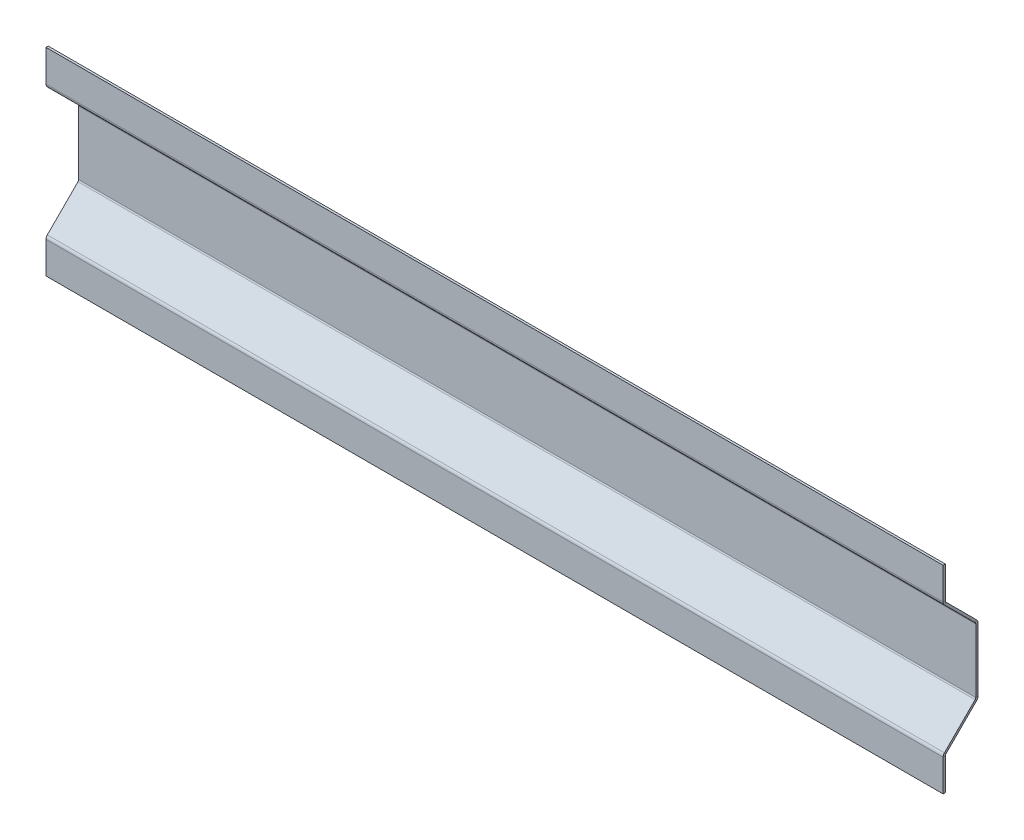
ISO-10303-21;
HEADER;
FILE_DESCRIPTION(('STEP AP214'),'2;1');
FILE_NAME('part.step','',(''),(''),'','','');
FILE_SCHEMA(('AUTOMOTIVE_DESIGN { 1 0 10303 214 1 1 1 1 }'));
ENDSEC;
DATA;
#1=APPLICATION_CONTEXT('core data for automotive mechanical design processes');
#2=APPLICATION_PROTOCOL_DEFINITION('international standard','automotive_design',2000,#1);
#3=PRODUCT_CONTEXT('',#1,'mechanical');
#4=PRODUCT('Part','Part','',(#3));
#5=PRODUCT_RELATED_PRODUCT_CATEGORY('part','',(#4));
#6=PRODUCT_DEFINITION_FORMATION('','',#4);
#7=PRODUCT_DEFINITION_CONTEXT('part definition',#1,'design');
#8=PRODUCT_DEFINITION('design','',#6,#7);
#9=PRODUCT_DEFINITION_SHAPE('','',#8);
#10=(LENGTH_UNIT() NAMED_UNIT(*) SI_UNIT(.MILLI.,.METRE.));
#11=(NAMED_UNIT(*) PLANE_ANGLE_UNIT() SI_UNIT($,.RADIAN.));
#12=(NAMED_UNIT(*) SI_UNIT($,.STERADIAN.) SOLID_ANGLE_UNIT());
#13=UNCERTAINTY_MEASURE_WITH_UNIT(LENGTH_MEASURE(1.E-05),#10,'distance_accuracy_value','');
#14=(GEOMETRIC_REPRESENTATION_CONTEXT(3) GLOBAL_UNCERTAINTY_ASSIGNED_CONTEXT((#13)) GLOBAL_UNIT_ASSIGNED_CONTEXT((#10,
#11,#12)) REPRESENTATION_CONTEXT('',''));
#15=CARTESIAN_POINT('',(0.,0.,0.));
#16=DIRECTION('',(0.,0.,1.));
#17=DIRECTION('',(1.,0.,0.));
#18=AXIS2_PLACEMENT_3D('',#15,#16,#17);
#19=CARTESIAN_POINT('',(200.,-30.5563491861041,14.556349186104));
#20=DIRECTION('',(-1.,0.,0.));
#21=DIRECTION('',(0.,0.,1.));
#22=AXIS2_PLACEMENT_3D('',#19,#20,#21);
#23=PLANE('',#22);
#24=DIRECTION('',(0.,0.707106781186545,0.70710678118655));
#25=VECTOR('',#24,1.);
#26=CARTESIAN_POINT('',(200.,-29.2634559672906,13.2634559672905));
#27=LINE('',#26,#25);
#28=CARTESIAN_POINT('',(200.,-29.2634559672906,13.2634559672905));
#29=VERTEX_POINT('',#28);
#30=CARTESIAN_POINT('',(200.,-28.5563491861041,13.9705627484771));
#31=VERTEX_POINT('',#30);
#32=EDGE_CURVE('E311',#29,#31,#27,.T.);
#33=ORIENTED_EDGE('',*,*,#32,.F.);
#34=DIRECTION('',(0.,-0.707106781186551,0.707106781186544));
#35=VECTOR('',#34,1.);
#36=CARTESIAN_POINT('',(200.,-7.29289321881336,-8.70710678118655));
#37=LINE('',#36,#35);
#38=CARTESIAN_POINT('',(200.,-15.5857864376269,-0.414213562373105));
#39=VERTEX_POINT('',#38);
#40=EDGE_CURVE('E413',#39,#29,#37,.T.);
#41=ORIENTED_EDGE('',*,*,#40,.F.);
#42=DIRECTION('',(0.,0.707106781186544,0.707106781186551));
#43=VECTOR('',#42,1.);
#44=CARTESIAN_POINT('',(200.,-14.8786796564403,0.292893218813448));
#45=LINE('',#44,#43);
#46=CARTESIAN_POINT('',(200.,-14.8786796564403,0.292893218813448));
#47=VERTEX_POINT('',#46);
#48=EDGE_CURVE('E424',#47,#39,#45,.F.);
#49=ORIENTED_EDGE('',*,*,#48,.F.);
#50=DIRECTION('',(0.,0.707106781186551,-0.707106781186544));
#51=VECTOR('',#50,1.);
#52=CARTESIAN_POINT('',(200.,-29.8492424049176,15.2634559672905));
#53=LINE('',#52,#51);
#54=EDGE_CURVE('E418',#47,#31,#53,.F.);
#55=ORIENTED_EDGE('',*,*,#54,.T.);
#56=EDGE_LOOP('',(#33,#41,#49,#55));
#57=FACE_BOUND('',#56,.T.);
#58=ADVANCED_FACE('F115',(#57),#23,.F.);
#59=CARTESIAN_POINT('',(-200.,-15.2928932188134,-0.707106781186551));
#60=DIRECTION('',(1.,0.,0.));
#61=DIRECTION('',(0.,0.,-1.));
#62=AXIS2_PLACEMENT_3D('',#59,#60,#61);
#63=PLANE('',#62);
#64=DIRECTION('',(0.,0.707106781186545,0.70710678118655));
#65=VECTOR('',#64,1.);
#66=CARTESIAN_POINT('',(-200.,-29.2634559672906,13.2634559672905));
#67=LINE('',#66,#65);
#68=CARTESIAN_POINT('',(-200.,-29.2634559672906,13.2634559672905));
#69=VERTEX_POINT('',#68);
#70=CARTESIAN_POINT('',(-200.,-28.5563491861041,13.9705627484771));
#71=VERTEX_POINT('',#70);
#72=EDGE_CURVE('E300',#69,#71,#67,.T.);
#73=ORIENTED_EDGE('',*,*,#72,.T.);
#74=DIRECTION('',(0.,-0.707106781186551,0.707106781186544));
#75=VECTOR('',#74,1.);
#76=CARTESIAN_POINT('',(-200.,-14.5857864376269,0.));
#77=LINE('',#76,#75);
#78=CARTESIAN_POINT('',(-200.,-14.8786796564403,0.292893218813448));
#79=VERTEX_POINT('',#78);
#80=EDGE_CURVE('E416',#71,#79,#77,.F.);
#81=ORIENTED_EDGE('',*,*,#80,.T.);
#82=DIRECTION('',(0.,0.707106781186544,0.707106781186551));
#83=VECTOR('',#82,1.);
#84=CARTESIAN_POINT('',(-200.,-15.5857864376269,-0.414213562373104));
#85=LINE('',#84,#83);
#86=CARTESIAN_POINT('',(-200.,-15.5857864376269,-0.414213562373103));
#87=VERTEX_POINT('',#86);
#88=EDGE_CURVE('E407',#79,#87,#85,.F.);
#89=ORIENTED_EDGE('',*,*,#88,.T.);
#90=DIRECTION('',(0.,0.707106781186551,-0.707106781186544));
#91=VECTOR('',#90,1.);
#92=CARTESIAN_POINT('',(-200.,-7.29289321881336,-8.70710678118655));
#93=LINE('',#92,#91);
#94=EDGE_CURVE('E410',#69,#87,#93,.T.);
#95=ORIENTED_EDGE('',*,*,#94,.F.);
#96=EDGE_LOOP('',(#73,#81,#89,#95));
#97=FACE_BOUND('',#96,.T.);
#98=ADVANCED_FACE('F534',(#97),#63,.F.);
#99=CARTESIAN_POINT('',(0.,-7.29289321881336,-8.70710678118655));
#100=DIRECTION('',(0.,0.707106781186544,0.707106781186551));
#101=DIRECTION('',(0.,-0.707106781186551,0.707106781186544));
#102=AXIS2_PLACEMENT_3D('',#99,#100,#101);
#103=PLANE('',#102);
#104=DIRECTION('',(-1.,0.,0.));
#105=VECTOR('',#104,1.);
#106=CARTESIAN_POINT('',(-200.,-29.2634559672906,13.2634559672905));
#107=LINE('',#106,#105);
#108=EDGE_CURVE('E306',#69,#29,#107,.F.);
#109=ORIENTED_EDGE('',*,*,#108,.F.);
#110=ORIENTED_EDGE('',*,*,#94,.T.);
#111=DIRECTION('',(1.,0.,0.));
#112=VECTOR('',#111,1.);
#113=CARTESIAN_POINT('',(-200.,-15.5857864376269,-0.414213562373104));
#114=LINE('',#113,#112);
#115=EDGE_CURVE('E421',#39,#87,#114,.F.);
#116=ORIENTED_EDGE('',*,*,#115,.F.);
#117=ORIENTED_EDGE('',*,*,#40,.T.);
#118=EDGE_LOOP('',(#109,#110,#116,#117));
#119=FACE_BOUND('',#118,.T.);
#120=ADVANCED_FACE('F488',(#119),#103,.F.);
#121=CARTESIAN_POINT('',(0.,-6.58578643762681,-8.));
#122=DIRECTION('',(0.,0.707106781186544,0.707106781186551));
#123=DIRECTION('',(0.,-0.707106781186551,0.707106781186544));
#124=AXIS2_PLACEMENT_3D('',#121,#122,#123);
#125=PLANE('',#124);
#126=ORIENTED_EDGE('',*,*,#80,.F.);
#127=DIRECTION('',(-1.,0.,0.));
#128=VECTOR('',#127,1.);
#129=CARTESIAN_POINT('',(-200.,-28.5563491861041,13.9705627484771));
#130=LINE('',#129,#128);
#131=EDGE_CURVE('E295',#71,#31,#130,.F.);
#132=ORIENTED_EDGE('',*,*,#131,.T.);
#133=ORIENTED_EDGE('',*,*,#54,.F.);
#134=DIRECTION('',(1.,0.,0.));
#135=VECTOR('',#134,1.);
#136=CARTESIAN_POINT('',(-200.,-14.8786796564403,0.292893218813448));
#137=LINE('',#136,#135);
#138=EDGE_CURVE('E427',#79,#47,#137,.T.);
#139=ORIENTED_EDGE('',*,*,#138,.F.);
#140=EDGE_LOOP('',(#126,#132,#133,#139));
#141=FACE_BOUND('',#140,.T.);
#142=ADVANCED_FACE('F478',(#141),#125,.T.);
#143=CARTESIAN_POINT('',(200.,15.2928932188134,-0.707106781186551));
#144=DIRECTION('',(-1.,0.,0.));
#145=DIRECTION('',(0.,0.,1.));
#146=AXIS2_PLACEMENT_3D('',#143,#144,#145);
#147=PLANE('',#146);
#148=DIRECTION('',(0.,-0.707106781186545,0.70710678118655));
#149=VECTOR('',#148,1.);
#150=CARTESIAN_POINT('',(200.,29.2634559672906,13.2634559672905));
#151=LINE('',#150,#149);
#152=CARTESIAN_POINT('',(200.,29.2634559672906,13.2634559672905));
#153=VERTEX_POINT('',#152);
#154=CARTESIAN_POINT('',(200.,28.5563491861041,13.9705627484771));
#155=VERTEX_POINT('',#154);
#156=EDGE_CURVE('E351',#153,#155,#151,.T.);
#157=ORIENTED_EDGE('',*,*,#156,.T.);
#158=DIRECTION('',(0.,0.707106781186551,0.707106781186544));
#159=VECTOR('',#158,1.);
#160=CARTESIAN_POINT('',(200.,14.5857864376269,0.));
#161=LINE('',#160,#159);
#162=CARTESIAN_POINT('',(200.,14.8786796564404,0.29289321881345));
#163=VERTEX_POINT('',#162);
#164=EDGE_CURVE('E375',#155,#163,#161,.F.);
#165=ORIENTED_EDGE('',*,*,#164,.T.);
#166=DIRECTION('',(0.,-0.707106781186544,0.707106781186551));
#167=VECTOR('',#166,1.);
#168=CARTESIAN_POINT('',(200.,15.5857864376269,-0.414213562373104));
#169=LINE('',#168,#167);
#170=CARTESIAN_POINT('',(200.,15.5857864376269,-0.414213562373102));
#171=VERTEX_POINT('',#170);
#172=EDGE_CURVE('E363',#163,#171,#169,.F.);
#173=ORIENTED_EDGE('',*,*,#172,.T.);
#174=DIRECTION('',(0.,-0.707106781186551,-0.707106781186544));
#175=VECTOR('',#174,1.);
#176=CARTESIAN_POINT('',(200.,7.29289321881336,-8.70710678118655));
#177=LINE('',#176,#175);
#178=EDGE_CURVE('E370',#153,#171,#177,.T.);
#179=ORIENTED_EDGE('',*,*,#178,.F.);
#180=EDGE_LOOP('',(#157,#165,#173,#179));
#181=FACE_BOUND('',#180,.T.);
#182=ADVANCED_FACE('F629',(#181),#147,.F.);
#183=CARTESIAN_POINT('',(-200.,30.5563491861041,14.556349186104));
#184=DIRECTION('',(1.,0.,0.));
#185=DIRECTION('',(0.,0.,-1.));
#186=AXIS2_PLACEMENT_3D('',#183,#184,#185);
#187=PLANE('',#186);
#188=DIRECTION('',(0.,-0.707106781186545,0.70710678118655));
#189=VECTOR('',#188,1.);
#190=CARTESIAN_POINT('',(-200.,29.2634559672906,13.2634559672905));
#191=LINE('',#190,#189);
#192=CARTESIAN_POINT('',(-200.,29.2634559672906,13.2634559672905));
#193=VERTEX_POINT('',#192);
#194=CARTESIAN_POINT('',(-200.,28.5563491861041,13.9705627484771));
#195=VERTEX_POINT('',#194);
#196=EDGE_CURVE('E361',#193,#195,#191,.T.);
#197=ORIENTED_EDGE('',*,*,#196,.F.);
#198=DIRECTION('',(0.,0.707106781186551,0.707106781186544));
#199=VECTOR('',#198,1.);
#200=CARTESIAN_POINT('',(-200.,7.29289321881336,-8.70710678118655));
#201=LINE('',#200,#199);
#202=CARTESIAN_POINT('',(-200.,15.5857864376269,-0.4142135623731));
#203=VERTEX_POINT('',#202);
#204=EDGE_CURVE('E366',#203,#193,#201,.T.);
#205=ORIENTED_EDGE('',*,*,#204,.F.);
#206=DIRECTION('',(0.,-0.707106781186544,0.707106781186551));
#207=VECTOR('',#206,1.);
#208=CARTESIAN_POINT('',(-200.,14.8786796564404,0.292893218813452));
#209=LINE('',#208,#207);
#210=CARTESIAN_POINT('',(-200.,14.8786796564404,0.29289321881345));
#211=VERTEX_POINT('',#210);
#212=EDGE_CURVE('E380',#211,#203,#209,.F.);
#213=ORIENTED_EDGE('',*,*,#212,.F.);
#214=DIRECTION('',(0.,-0.707106781186551,-0.707106781186544));
#215=VECTOR('',#214,1.);
#216=CARTESIAN_POINT('',(-200.,29.8492424049176,15.2634559672905));
#217=LINE('',#216,#215);
#218=EDGE_CURVE('E372',#211,#195,#217,.F.);
#219=ORIENTED_EDGE('',*,*,#218,.T.);
#220=EDGE_LOOP('',(#197,#205,#213,#219));
#221=FACE_BOUND('',#220,.T.);
#222=ADVANCED_FACE('F512',(#221),#187,.F.);
#223=CARTESIAN_POINT('',(0.,7.29289321881336,-8.70710678118655));
#224=DIRECTION('',(0.,-0.707106781186544,0.707106781186551));
#225=DIRECTION('',(0.,-0.707106781186551,-0.707106781186544));
#226=AXIS2_PLACEMENT_3D('',#223,#224,#225);
#227=PLANE('',#226);
#228=DIRECTION('',(1.,0.,0.));
#229=VECTOR('',#228,1.);
#230=CARTESIAN_POINT('',(200.,29.2634559672906,13.2634559672905));
#231=LINE('',#230,#229);
#232=EDGE_CURVE('E357',#153,#193,#231,.F.);
#233=ORIENTED_EDGE('',*,*,#232,.F.);
#234=ORIENTED_EDGE('',*,*,#178,.T.);
#235=DIRECTION('',(-1.,0.,0.));
#236=VECTOR('',#235,1.);
#237=CARTESIAN_POINT('',(200.,15.5857864376269,-0.414213562373104));
#238=LINE('',#237,#236);
#239=EDGE_CURVE('E377',#203,#171,#238,.F.);
#240=ORIENTED_EDGE('',*,*,#239,.F.);
#241=ORIENTED_EDGE('',*,*,#204,.T.);
#242=EDGE_LOOP('',(#233,#234,#240,#241));
#243=FACE_BOUND('',#242,.T.);
#244=ADVANCED_FACE('F519',(#243),#227,.F.);
#245=CARTESIAN_POINT('',(0.,6.58578643762681,-8.));
#246=DIRECTION('',(0.,-0.707106781186544,0.707106781186551));
#247=DIRECTION('',(0.,-0.707106781186551,-0.707106781186544));
#248=AXIS2_PLACEMENT_3D('',#245,#246,#247);
#249=PLANE('',#248);
#250=ORIENTED_EDGE('',*,*,#164,.F.);
#251=DIRECTION('',(1.,0.,0.));
#252=VECTOR('',#251,1.);
#253=CARTESIAN_POINT('',(200.,28.5563491861041,13.9705627484771));
#254=LINE('',#253,#252);
#255=EDGE_CURVE('E346',#155,#195,#254,.F.);
#256=ORIENTED_EDGE('',*,*,#255,.T.);
#257=ORIENTED_EDGE('',*,*,#218,.F.);
#258=DIRECTION('',(-1.,0.,0.));
#259=VECTOR('',#258,1.);
#260=CARTESIAN_POINT('',(200.,14.8786796564403,0.292893218813448));
#261=LINE('',#260,#259);
#262=EDGE_CURVE('E383',#163,#211,#261,.T.);
#263=ORIENTED_EDGE('',*,*,#262,.F.);
#264=EDGE_LOOP('',(#250,#256,#257,#263));
#265=FACE_BOUND('',#264,.T.);
#266=ADVANCED_FACE('F508',(#265),#249,.T.);
#267=CARTESIAN_POINT('',(0.,0.,-1.));
#268=DIRECTION('',(0.,0.,-1.));
#269=DIRECTION('',(-1.,0.,0.));
#270=AXIS2_PLACEMENT_3D('',#267,#268,#269);
#271=PLANE('',#270);
#272=DIRECTION('',(0.,-1.,0.));
#273=VECTOR('',#272,1.);
#274=CARTESIAN_POINT('',(-200.,-16.,-1.));
#275=LINE('',#274,#273);
#276=CARTESIAN_POINT('',(-200.,14.1715728752538,-0.999999999999999));
#277=VERTEX_POINT('',#276);
#278=CARTESIAN_POINT('',(-200.,-14.1715728752538,-1.));
#279=VERTEX_POINT('',#278);
#280=EDGE_CURVE('E13',#277,#279,#275,.T.);
#281=ORIENTED_EDGE('',*,*,#280,.F.);
#282=DIRECTION('',(-1.,0.,0.));
#283=VECTOR('',#282,1.);
#284=CARTESIAN_POINT('',(-200.,14.1715728752538,-0.999999999999999));
#285=LINE('',#284,#283);
#286=CARTESIAN_POINT('',(200.,14.1715728752538,-1.));
#287=VERTEX_POINT('',#286);
#288=EDGE_CURVE('E387',#277,#287,#285,.F.);
#289=ORIENTED_EDGE('',*,*,#288,.T.);
#290=DIRECTION('',(0.,1.,0.));
#291=VECTOR('',#290,1.);
#292=CARTESIAN_POINT('',(200.,-16.,-1.));
#293=LINE('',#292,#291);
#294=CARTESIAN_POINT('',(200.,-14.1715728752538,-1.));
#295=VERTEX_POINT('',#294);
#296=EDGE_CURVE('E124',#295,#287,#293,.T.);
#297=ORIENTED_EDGE('',*,*,#296,.F.);
#298=DIRECTION('',(1.,0.,0.));
#299=VECTOR('',#298,1.);
#300=CARTESIAN_POINT('',(200.,-14.1715728752538,-1.));
#301=LINE('',#300,#299);
#302=EDGE_CURVE('E431',#295,#279,#301,.F.);
#303=ORIENTED_EDGE('',*,*,#302,.T.);
#304=EDGE_LOOP('',(#281,#289,#297,#303));
#305=FACE_BOUND('',#304,.T.);
#306=ADVANCED_FACE('F494',(#305),#271,.T.);
#307=CARTESIAN_POINT('',(0.,0.,0.));
#308=DIRECTION('',(0.,0.,-1.));
#309=DIRECTION('',(-1.,0.,0.));
#310=AXIS2_PLACEMENT_3D('',#307,#308,#309);
#311=PLANE('',#310);
#312=DIRECTION('',(-1.,0.,0.));
#313=VECTOR('',#312,1.);
#314=CARTESIAN_POINT('',(-200.,14.1715728752538,0.));
#315=LINE('',#314,#313);
#316=CARTESIAN_POINT('',(-200.,14.1715728752538,0.));
#317=VERTEX_POINT('',#316);
#318=CARTESIAN_POINT('',(200.,14.1715728752538,0.));
#319=VERTEX_POINT('',#318);
#320=EDGE_CURVE('E400',#317,#319,#315,.F.);
#321=ORIENTED_EDGE('',*,*,#320,.F.);
#322=DIRECTION('',(0.,-1.,0.));
#323=VECTOR('',#322,1.);
#324=CARTESIAN_POINT('',(-200.,-16.,0.));
#325=LINE('',#324,#323);
#326=CARTESIAN_POINT('',(-200.,-14.1715728752538,0.));
#327=VERTEX_POINT('',#326);
#328=EDGE_CURVE('E119',#317,#327,#325,.T.);
#329=ORIENTED_EDGE('',*,*,#328,.T.);
#330=DIRECTION('',(1.,0.,0.));
#331=VECTOR('',#330,1.);
#332=CARTESIAN_POINT('',(200.,-14.1715728752538,0.));
#333=LINE('',#332,#331);
#334=CARTESIAN_POINT('',(200.,-14.1715728752538,0.));
#335=VERTEX_POINT('',#334);
#336=EDGE_CURVE('E444',#335,#327,#333,.F.);
#337=ORIENTED_EDGE('',*,*,#336,.F.);
#338=DIRECTION('',(0.,1.,0.));
#339=VECTOR('',#338,1.);
#340=CARTESIAN_POINT('',(200.,-16.,0.));
#341=LINE('',#340,#339);
#342=EDGE_CURVE('E451',#335,#319,#341,.T.);
#343=ORIENTED_EDGE('',*,*,#342,.T.);
#344=EDGE_LOOP('',(#321,#329,#337,#343));
#345=FACE_BOUND('',#344,.T.);
#346=ADVANCED_FACE('F463',(#345),#311,.F.);
#347=CARTESIAN_POINT('',(-200.,-16.,-1.));
#348=DIRECTION('',(-1.,0.,0.));
#349=DIRECTION('',(0.,0.,1.));
#350=AXIS2_PLACEMENT_3D('',#347,#348,#349);
#351=PLANE('',#350);
#352=ORIENTED_EDGE('',*,*,#328,.F.);
#353=DIRECTION('',(0.,0.,-1.));
#354=VECTOR('',#353,1.);
#355=CARTESIAN_POINT('',(-200.,14.1715728752538,0.));
#356=LINE('',#355,#354);
#357=EDGE_CURVE('E394',#317,#277,#356,.T.);
#358=ORIENTED_EDGE('',*,*,#357,.T.);
#359=ORIENTED_EDGE('',*,*,#280,.T.);
#360=DIRECTION('',(0.,0.,-1.));
#361=VECTOR('',#360,1.);
#362=CARTESIAN_POINT('',(-200.,-14.1715728752538,0.));
#363=LINE('',#362,#361);
#364=EDGE_CURVE('E448',#327,#279,#363,.T.);
#365=ORIENTED_EDGE('',*,*,#364,.F.);
#366=EDGE_LOOP('',(#352,#358,#359,#365));
#367=FACE_BOUND('',#366,.T.);
#368=ADVANCED_FACE('F465',(#367),#351,.T.);
#369=CARTESIAN_POINT('',(200.,-16.,-1.));
#370=DIRECTION('',(1.,0.,0.));
#371=DIRECTION('',(0.,0.,-1.));
#372=AXIS2_PLACEMENT_3D('',#369,#370,#371);
#373=PLANE('',#372);
#374=DIRECTION('',(0.,0.,-1.));
#375=VECTOR('',#374,1.);
#376=CARTESIAN_POINT('',(200.,14.1715728752538,0.));
#377=LINE('',#376,#375);
#378=EDGE_CURVE('E404',#319,#287,#377,.T.);
#379=ORIENTED_EDGE('',*,*,#378,.F.);
#380=ORIENTED_EDGE('',*,*,#342,.F.);
#381=DIRECTION('',(0.,0.,-1.));
#382=VECTOR('',#381,1.);
#383=CARTESIAN_POINT('',(200.,-14.1715728752538,0.));
#384=LINE('',#383,#382);
#385=EDGE_CURVE('E438',#335,#295,#384,.T.);
#386=ORIENTED_EDGE('',*,*,#385,.T.);
#387=ORIENTED_EDGE('',*,*,#296,.T.);
#388=EDGE_LOOP('',(#379,#380,#386,#387));
#389=FACE_BOUND('',#388,.T.);
#390=ADVANCED_FACE('F117',(#389),#373,.T.);
#391=CARTESIAN_POINT('',(-200.,-14.1715728752538,0.999999999999998));
#392=DIRECTION('',(-1.,0.,0.));
#393=DIRECTION('',(0.,0.,1.));
#394=AXIS2_PLACEMENT_3D('',#391,#392,#393);
#395=PLANE('',#394);
#396=ORIENTED_EDGE('',*,*,#88,.F.);
#397=CARTESIAN_POINT('',(-200.,-14.1715728752538,0.999999999999998));
#398=DIRECTION('',(1.,0.,0.));
#399=DIRECTION('',(0.,0.,-1.));
#400=AXIS2_PLACEMENT_3D('',#397,#398,#399);
#401=CIRCLE('',#400,0.999999999999999);
#402=EDGE_CURVE('E441',#327,#79,#401,.F.);
#403=ORIENTED_EDGE('',*,*,#402,.F.);
#404=ORIENTED_EDGE('',*,*,#364,.T.);
#405=CARTESIAN_POINT('',(-200.,-14.1715728752538,0.999999999999998));
#406=DIRECTION('',(1.,0.,0.));
#407=DIRECTION('',(0.,0.,-1.));
#408=AXIS2_PLACEMENT_3D('',#405,#406,#407);
#409=CIRCLE('',#408,2.);
#410=EDGE_CURVE('E434',#279,#87,#409,.F.);
#411=ORIENTED_EDGE('',*,*,#410,.T.);
#412=EDGE_LOOP('',(#396,#403,#404,#411));
#413=FACE_BOUND('',#412,.T.);
#414=ADVANCED_FACE('F470',(#413),#395,.T.);
#415=CARTESIAN_POINT('',(200.,-14.1715728752538,0.999999999999998));
#416=DIRECTION('',(-1.,0.,0.));
#417=DIRECTION('',(0.,0.,1.));
#418=AXIS2_PLACEMENT_3D('',#415,#416,#417);
#419=PLANE('',#418);
#420=CARTESIAN_POINT('',(200.,-14.1715728752538,0.999999999999998));
#421=DIRECTION('',(1.,0.,0.));
#422=DIRECTION('',(0.,0.,-1.));
#423=AXIS2_PLACEMENT_3D('',#420,#421,#422);
#424=CIRCLE('',#423,0.999999999999999);
#425=EDGE_CURVE('E412',#47,#335,#424,.T.);
#426=ORIENTED_EDGE('',*,*,#425,.F.);
#427=ORIENTED_EDGE('',*,*,#48,.T.);
#428=CARTESIAN_POINT('',(200.,-14.1715728752538,0.999999999999998));
#429=DIRECTION('',(1.,0.,0.));
#430=DIRECTION('',(0.,0.,-1.));
#431=AXIS2_PLACEMENT_3D('',#428,#429,#430);
#432=CIRCLE('',#431,2.);
#433=EDGE_CURVE('E435',#39,#295,#432,.T.);
#434=ORIENTED_EDGE('',*,*,#433,.T.);
#435=ORIENTED_EDGE('',*,*,#385,.F.);
#436=EDGE_LOOP('',(#426,#427,#434,#435));
#437=FACE_BOUND('',#436,.T.);
#438=ADVANCED_FACE('F485',(#437),#419,.F.);
#439=CARTESIAN_POINT('',(200.,-14.1715728752538,0.999999999999998));
#440=DIRECTION('',(1.,0.,0.));
#441=DIRECTION('',(0.,-0.707106781186544,-0.707106781186551));
#442=AXIS2_PLACEMENT_3D('',#439,#440,#441);
#443=CYLINDRICAL_SURFACE('',#442,2.);
#444=ORIENTED_EDGE('',*,*,#302,.F.);
#445=ORIENTED_EDGE('',*,*,#433,.F.);
#446=ORIENTED_EDGE('',*,*,#115,.T.);
#447=ORIENTED_EDGE('',*,*,#410,.F.);
#448=EDGE_LOOP('',(#444,#445,#446,#447));
#449=FACE_BOUND('',#448,.T.);
#450=ADVANCED_FACE('F491',(#449),#443,.T.);
#451=CARTESIAN_POINT('',(200.,-14.1715728752538,0.999999999999998));
#452=DIRECTION('',(1.,0.,0.));
#453=DIRECTION('',(0.,-0.707106781186544,-0.707106781186551));
#454=AXIS2_PLACEMENT_3D('',#451,#452,#453);
#455=CYLINDRICAL_SURFACE('',#454,0.999999999999999);
#456=ORIENTED_EDGE('',*,*,#336,.T.);
#457=ORIENTED_EDGE('',*,*,#402,.T.);
#458=ORIENTED_EDGE('',*,*,#138,.T.);
#459=ORIENTED_EDGE('',*,*,#425,.T.);
#460=EDGE_LOOP('',(#456,#457,#458,#459));
#461=FACE_BOUND('',#460,.T.);
#462=ADVANCED_FACE('F473',(#461),#455,.F.);
#463=CARTESIAN_POINT('',(200.,14.1715728752538,1.));
#464=DIRECTION('',(1.,0.,0.));
#465=DIRECTION('',(0.,0.,-1.));
#466=AXIS2_PLACEMENT_3D('',#463,#464,#465);
#467=PLANE('',#466);
#468=ORIENTED_EDGE('',*,*,#172,.F.);
#469=CARTESIAN_POINT('',(200.,14.1715728752538,1.));
#470=DIRECTION('',(-1.,0.,0.));
#471=DIRECTION('',(0.,0.,1.));
#472=AXIS2_PLACEMENT_3D('',#469,#470,#471);
#473=CIRCLE('',#472,0.999999999999999);
#474=EDGE_CURVE('E397',#319,#163,#473,.F.);
#475=ORIENTED_EDGE('',*,*,#474,.F.);
#476=ORIENTED_EDGE('',*,*,#378,.T.);
#477=CARTESIAN_POINT('',(200.,14.1715728752538,1.));
#478=DIRECTION('',(-1.,0.,0.));
#479=DIRECTION('',(0.,0.,1.));
#480=AXIS2_PLACEMENT_3D('',#477,#478,#479);
#481=CIRCLE('',#480,2.);
#482=EDGE_CURVE('E390',#287,#171,#481,.F.);
#483=ORIENTED_EDGE('',*,*,#482,.T.);
#484=EDGE_LOOP('',(#468,#475,#476,#483));
#485=FACE_BOUND('',#484,.T.);
#486=ADVANCED_FACE('F500',(#485),#467,.T.);
#487=CARTESIAN_POINT('',(-200.,14.1715728752538,1.));
#488=DIRECTION('',(1.,0.,0.));
#489=DIRECTION('',(0.,0.,-1.));
#490=AXIS2_PLACEMENT_3D('',#487,#488,#489);
#491=PLANE('',#490);
#492=CARTESIAN_POINT('',(-200.,14.1715728752538,1.));
#493=DIRECTION('',(-1.,0.,0.));
#494=DIRECTION('',(0.,0.,1.));
#495=AXIS2_PLACEMENT_3D('',#492,#493,#494);
#496=CIRCLE('',#495,0.999999999999999);
#497=EDGE_CURVE('E369',#211,#317,#496,.T.);
#498=ORIENTED_EDGE('',*,*,#497,.F.);
#499=ORIENTED_EDGE('',*,*,#212,.T.);
#500=CARTESIAN_POINT('',(-200.,14.1715728752538,1.));
#501=DIRECTION('',(-1.,0.,0.));
#502=DIRECTION('',(0.,0.,1.));
#503=AXIS2_PLACEMENT_3D('',#500,#501,#502);
#504=CIRCLE('',#503,2.);
#505=EDGE_CURVE('E391',#203,#277,#504,.T.);
#506=ORIENTED_EDGE('',*,*,#505,.T.);
#507=ORIENTED_EDGE('',*,*,#357,.F.);
#508=EDGE_LOOP('',(#498,#499,#506,#507));
#509=FACE_BOUND('',#508,.T.);
#510=ADVANCED_FACE('F516',(#509),#491,.F.);
#511=CARTESIAN_POINT('',(-200.,14.1715728752538,1.));
#512=DIRECTION('',(-1.,0.,0.));
#513=DIRECTION('',(0.,0.707106781186544,-0.707106781186551));
#514=AXIS2_PLACEMENT_3D('',#511,#512,#513);
#515=CYLINDRICAL_SURFACE('',#514,2.);
#516=ORIENTED_EDGE('',*,*,#288,.F.);
#517=ORIENTED_EDGE('',*,*,#505,.F.);
#518=ORIENTED_EDGE('',*,*,#239,.T.);
#519=ORIENTED_EDGE('',*,*,#482,.F.);
#520=EDGE_LOOP('',(#516,#517,#518,#519));
#521=FACE_BOUND('',#520,.T.);
#522=ADVANCED_FACE('F522',(#521),#515,.T.);
#523=CARTESIAN_POINT('',(-200.,14.1715728752538,1.));
#524=DIRECTION('',(-1.,0.,0.));
#525=DIRECTION('',(0.,0.707106781186544,-0.707106781186551));
#526=AXIS2_PLACEMENT_3D('',#523,#524,#525);
#527=CYLINDRICAL_SURFACE('',#526,0.999999999999999);
#528=ORIENTED_EDGE('',*,*,#320,.T.);
#529=ORIENTED_EDGE('',*,*,#474,.T.);
#530=ORIENTED_EDGE('',*,*,#262,.T.);
#531=ORIENTED_EDGE('',*,*,#497,.T.);
#532=EDGE_LOOP('',(#528,#529,#530,#531));
#533=FACE_BOUND('',#532,.T.);
#534=ADVANCED_FACE('F503',(#533),#527,.F.);
#535=CARTESIAN_POINT('',(-200.,29.9705627484772,12.556349186104));
#536=DIRECTION('',(-1.,0.,0.));
#537=DIRECTION('',(0.,0.,1.));
#538=AXIS2_PLACEMENT_3D('',#535,#536,#537);
#539=PLANE('',#538);
#540=DIRECTION('',(0.,0.,-1.));
#541=VECTOR('',#540,1.);
#542=CARTESIAN_POINT('',(-200.,29.9705627484772,14.556349186104));
#543=LINE('',#542,#541);
#544=CARTESIAN_POINT('',(-200.,29.9705627484772,13.556349186104));
#545=VERTEX_POINT('',#544);
#546=CARTESIAN_POINT('',(-200.,29.9705627484772,14.556349186104));
#547=VERTEX_POINT('',#546);
#548=EDGE_CURVE('E313',#545,#547,#543,.F.);
#549=ORIENTED_EDGE('',*,*,#548,.F.);
#550=CARTESIAN_POINT('',(-200.,29.9705627484772,12.556349186104));
#551=DIRECTION('',(1.,0.,0.));
#552=DIRECTION('',(0.,0.,-1.));
#553=AXIS2_PLACEMENT_3D('',#550,#551,#552);
#554=CIRCLE('',#553,0.999999999999999);
#555=EDGE_CURVE('E354',#193,#545,#554,.F.);
#556=ORIENTED_EDGE('',*,*,#555,.F.);
#557=ORIENTED_EDGE('',*,*,#196,.T.);
#558=CARTESIAN_POINT('',(-200.,29.9705627484772,12.556349186104));
#559=DIRECTION('',(1.,0.,0.));
#560=DIRECTION('',(0.,0.,-1.));
#561=AXIS2_PLACEMENT_3D('',#558,#559,#560);
#562=CIRCLE('',#561,2.);
#563=EDGE_CURVE('E140',#195,#547,#562,.F.);
#564=ORIENTED_EDGE('',*,*,#563,.T.);
#565=EDGE_LOOP('',(#549,#556,#557,#564));
#566=FACE_BOUND('',#565,.T.);
#567=ADVANCED_FACE('F529',(#566),#539,.T.);
#568=CARTESIAN_POINT('',(200.,29.9705627484772,12.556349186104));
#569=DIRECTION('',(-1.,0.,0.));
#570=DIRECTION('',(0.,0.,1.));
#571=AXIS2_PLACEMENT_3D('',#568,#569,#570);
#572=PLANE('',#571);
#573=CARTESIAN_POINT('',(200.,29.9705627484772,12.556349186104));
#574=DIRECTION('',(1.,0.,0.));
#575=DIRECTION('',(0.,0.,-1.));
#576=AXIS2_PLACEMENT_3D('',#573,#574,#575);
#577=CIRCLE('',#576,0.999999999999999);
#578=CARTESIAN_POINT('',(200.,29.9705627484772,13.556349186104));
#579=VERTEX_POINT('',#578);
#580=EDGE_CURVE('E319',#579,#153,#577,.T.);
#581=ORIENTED_EDGE('',*,*,#580,.F.);
#582=DIRECTION('',(0.,0.,-1.));
#583=VECTOR('',#582,1.);
#584=CARTESIAN_POINT('',(200.,29.9705627484772,13.556349186104));
#585=LINE('',#584,#583);
#586=CARTESIAN_POINT('',(200.,29.9705627484772,14.556349186104));
#587=VERTEX_POINT('',#586);
#588=EDGE_CURVE('E339',#579,#587,#585,.F.);
#589=ORIENTED_EDGE('',*,*,#588,.T.);
#590=CARTESIAN_POINT('',(200.,29.9705627484772,12.556349186104));
#591=DIRECTION('',(1.,0.,0.));
#592=DIRECTION('',(0.,0.,-1.));
#593=AXIS2_PLACEMENT_3D('',#590,#591,#592);
#594=CIRCLE('',#593,2.);
#595=EDGE_CURVE('E349',#587,#155,#594,.T.);
#596=ORIENTED_EDGE('',*,*,#595,.T.);
#597=ORIENTED_EDGE('',*,*,#156,.F.);
#598=EDGE_LOOP('',(#581,#589,#596,#597));
#599=FACE_BOUND('',#598,.T.);
#600=ADVANCED_FACE('F667',(#599),#572,.F.);
#601=CARTESIAN_POINT('',(200.,29.9705627484772,12.556349186104));
#602=DIRECTION('',(1.,0.,0.));
#603=DIRECTION('',(0.,0.,1.));
#604=AXIS2_PLACEMENT_3D('',#601,#602,#603);
#605=CYLINDRICAL_SURFACE('',#604,2.);
#606=ORIENTED_EDGE('',*,*,#255,.F.);
#607=ORIENTED_EDGE('',*,*,#595,.F.);
#608=DIRECTION('',(1.,0.,0.));
#609=VECTOR('',#608,1.);
#610=CARTESIAN_POINT('',(-200.,29.9705627484772,14.556349186104));
#611=LINE('',#610,#609);
#612=EDGE_CURVE('E337',#587,#547,#611,.F.);
#613=ORIENTED_EDGE('',*,*,#612,.T.);
#614=ORIENTED_EDGE('',*,*,#563,.F.);
#615=EDGE_LOOP('',(#606,#607,#613,#614));
#616=FACE_BOUND('',#615,.T.);
#617=ADVANCED_FACE('F677',(#616),#605,.T.);
#618=CARTESIAN_POINT('',(200.,29.9705627484772,12.556349186104));
#619=DIRECTION('',(1.,0.,0.));
#620=DIRECTION('',(0.,0.,1.));
#621=AXIS2_PLACEMENT_3D('',#618,#619,#620);
#622=CYLINDRICAL_SURFACE('',#621,0.999999999999999);
#623=ORIENTED_EDGE('',*,*,#232,.T.);
#624=ORIENTED_EDGE('',*,*,#555,.T.);
#625=DIRECTION('',(1.,0.,0.));
#626=VECTOR('',#625,1.);
#627=CARTESIAN_POINT('',(-200.,29.9705627484772,13.556349186104));
#628=LINE('',#627,#626);
#629=EDGE_CURVE('E342',#545,#579,#628,.T.);
#630=ORIENTED_EDGE('',*,*,#629,.T.);
#631=ORIENTED_EDGE('',*,*,#580,.T.);
#632=EDGE_LOOP('',(#623,#624,#630,#631));
#633=FACE_BOUND('',#632,.T.);
#634=ADVANCED_FACE('F688',(#633),#622,.F.);
#635=CARTESIAN_POINT('',(200.,44.142135623731,14.556349186104));
#636=DIRECTION('',(-1.,0.,0.));
#637=DIRECTION('',(0.,0.,1.));
#638=AXIS2_PLACEMENT_3D('',#635,#636,#637);
#639=PLANE('',#638);
#640=ORIENTED_EDGE('',*,*,#588,.F.);
#641=DIRECTION('',(0.,-1.,0.));
#642=VECTOR('',#641,1.);
#643=CARTESIAN_POINT('',(200.,44.142135623731,13.556349186104));
#644=LINE('',#643,#642);
#645=CARTESIAN_POINT('',(200.,44.142135623731,13.556349186104));
#646=VERTEX_POINT('',#645);
#647=EDGE_CURVE('E335',#579,#646,#644,.F.);
#648=ORIENTED_EDGE('',*,*,#647,.T.);
#649=DIRECTION('',(0.,0.,-1.));
#650=VECTOR('',#649,1.);
#651=CARTESIAN_POINT('',(200.,44.142135623731,14.556349186104));
#652=LINE('',#651,#650);
#653=CARTESIAN_POINT('',(200.,44.142135623731,14.556349186104));
#654=VERTEX_POINT('',#653);
#655=EDGE_CURVE('E316',#654,#646,#652,.T.);
#656=ORIENTED_EDGE('',*,*,#655,.F.);
#657=DIRECTION('',(0.,1.,0.));
#658=VECTOR('',#657,1.);
#659=CARTESIAN_POINT('',(200.,-1.00000000000001,14.556349186104));
#660=LINE('',#659,#658);
#661=EDGE_CURVE('E328',#587,#654,#660,.T.);
#662=ORIENTED_EDGE('',*,*,#661,.F.);
#663=EDGE_LOOP('',(#640,#648,#656,#662));
#664=FACE_BOUND('',#663,.T.);
#665=ADVANCED_FACE('F698',(#664),#639,.F.);
#666=CARTESIAN_POINT('',(-200.,29.5563491861041,14.556349186104));
#667=DIRECTION('',(1.,0.,0.));
#668=DIRECTION('',(0.,0.,-1.));
#669=AXIS2_PLACEMENT_3D('',#666,#667,#668);
#670=PLANE('',#669);
#671=ORIENTED_EDGE('',*,*,#548,.T.);
#672=DIRECTION('',(0.,-1.,0.));
#673=VECTOR('',#672,1.);
#674=CARTESIAN_POINT('',(-200.,-1.00000000000001,14.556349186104));
#675=LINE('',#674,#673);
#676=CARTESIAN_POINT('',(-200.,44.142135623731,14.556349186104));
#677=VERTEX_POINT('',#676);
#678=EDGE_CURVE('E323',#677,#547,#675,.T.);
#679=ORIENTED_EDGE('',*,*,#678,.F.);
#680=DIRECTION('',(0.,0.,-1.));
#681=VECTOR('',#680,1.);
#682=CARTESIAN_POINT('',(-200.,44.142135623731,14.556349186104));
#683=LINE('',#682,#681);
#684=CARTESIAN_POINT('',(-200.,44.142135623731,13.556349186104));
#685=VERTEX_POINT('',#684);
#686=EDGE_CURVE('E320',#677,#685,#683,.T.);
#687=ORIENTED_EDGE('',*,*,#686,.T.);
#688=DIRECTION('',(0.,1.,0.));
#689=VECTOR('',#688,1.);
#690=CARTESIAN_POINT('',(-200.,29.5563491861041,13.556349186104));
#691=LINE('',#690,#689);
#692=EDGE_CURVE('E330',#685,#545,#691,.F.);
#693=ORIENTED_EDGE('',*,*,#692,.T.);
#694=EDGE_LOOP('',(#671,#679,#687,#693));
#695=FACE_BOUND('',#694,.T.);
#696=ADVANCED_FACE('F709',(#695),#670,.F.);
#697=CARTESIAN_POINT('',(0.,-1.00000000000001,14.556349186104));
#698=DIRECTION('',(0.,0.,-1.));
#699=DIRECTION('',(-1.,0.,0.));
#700=AXIS2_PLACEMENT_3D('',#697,#698,#699);
#701=PLANE('',#700);
#702=ORIENTED_EDGE('',*,*,#612,.F.);
#703=ORIENTED_EDGE('',*,*,#661,.T.);
#704=DIRECTION('',(-1.,0.,0.));
#705=VECTOR('',#704,1.);
#706=CARTESIAN_POINT('',(0.,44.142135623731,14.556349186104));
#707=LINE('',#706,#705);
#708=EDGE_CURVE('E326',#654,#677,#707,.T.);
#709=ORIENTED_EDGE('',*,*,#708,.T.);
#710=ORIENTED_EDGE('',*,*,#678,.T.);
#711=EDGE_LOOP('',(#702,#703,#709,#710));
#712=FACE_BOUND('',#711,.T.);
#713=ADVANCED_FACE('F720',(#712),#701,.F.);
#714=CARTESIAN_POINT('',(0.,-1.00000000000001,13.556349186104));
#715=DIRECTION('',(0.,0.,-1.));
#716=DIRECTION('',(-1.,0.,0.));
#717=AXIS2_PLACEMENT_3D('',#714,#715,#716);
#718=PLANE('',#717);
#719=ORIENTED_EDGE('',*,*,#647,.F.);
#720=ORIENTED_EDGE('',*,*,#629,.F.);
#721=ORIENTED_EDGE('',*,*,#692,.F.);
#722=DIRECTION('',(1.,0.,0.));
#723=VECTOR('',#722,1.);
#724=CARTESIAN_POINT('',(-200.,44.142135623731,13.556349186104));
#725=LINE('',#724,#723);
#726=EDGE_CURVE('E333',#646,#685,#725,.F.);
#727=ORIENTED_EDGE('',*,*,#726,.F.);
#728=EDGE_LOOP('',(#719,#720,#721,#727));
#729=FACE_BOUND('',#728,.T.);
#730=ADVANCED_FACE('F731',(#729),#718,.T.);
#731=CARTESIAN_POINT('',(-200.,44.142135623731,14.556349186104));
#732=DIRECTION('',(0.,-1.,0.));
#733=DIRECTION('',(0.,0.,-1.));
#734=AXIS2_PLACEMENT_3D('',#731,#732,#733);
#735=PLANE('',#734);
#736=ORIENTED_EDGE('',*,*,#726,.T.);
#737=ORIENTED_EDGE('',*,*,#686,.F.);
#738=ORIENTED_EDGE('',*,*,#708,.F.);
#739=ORIENTED_EDGE('',*,*,#655,.T.);
#740=EDGE_LOOP('',(#736,#737,#738,#739));
#741=FACE_BOUND('',#740,.T.);
#742=ADVANCED_FACE('F742',(#741),#735,.F.);
#743=CARTESIAN_POINT('',(200.,-29.9705627484772,12.556349186104));
#744=DIRECTION('',(1.,0.,0.));
#745=DIRECTION('',(0.,0.,-1.));
#746=AXIS2_PLACEMENT_3D('',#743,#744,#745);
#747=PLANE('',#746);
#748=DIRECTION('',(0.,0.,-1.));
#749=VECTOR('',#748,1.);
#750=CARTESIAN_POINT('',(200.,-29.9705627484772,14.556349186104));
#751=LINE('',#750,#749);
#752=CARTESIAN_POINT('',(200.,-29.9705627484772,13.556349186104));
#753=VERTEX_POINT('',#752);
#754=CARTESIAN_POINT('',(200.,-29.9705627484772,14.556349186104));
#755=VERTEX_POINT('',#754);
#756=EDGE_CURVE('E278',#753,#755,#751,.F.);
#757=ORIENTED_EDGE('',*,*,#756,.F.);
#758=CARTESIAN_POINT('',(200.,-29.9705627484772,12.556349186104));
#759=DIRECTION('',(-1.,0.,0.));
#760=DIRECTION('',(0.,0.,1.));
#761=AXIS2_PLACEMENT_3D('',#758,#759,#760);
#762=CIRCLE('',#761,0.999999999999999);
#763=EDGE_CURVE('E303',#29,#753,#762,.F.);
#764=ORIENTED_EDGE('',*,*,#763,.F.);
#765=ORIENTED_EDGE('',*,*,#32,.T.);
#766=CARTESIAN_POINT('',(200.,-29.9705627484772,12.556349186104));
#767=DIRECTION('',(-1.,0.,0.));
#768=DIRECTION('',(0.,0.,1.));
#769=AXIS2_PLACEMENT_3D('',#766,#767,#768);
#770=CIRCLE('',#769,2.);
#771=EDGE_CURVE('E132',#31,#755,#770,.F.);
#772=ORIENTED_EDGE('',*,*,#771,.T.);
#773=EDGE_LOOP('',(#757,#764,#765,#772));
#774=FACE_BOUND('',#773,.T.);
#775=ADVANCED_FACE('F753',(#774),#747,.T.);
#776=CARTESIAN_POINT('',(-200.,-29.9705627484772,12.556349186104));
#777=DIRECTION('',(1.,0.,0.));
#778=DIRECTION('',(0.,0.,-1.));
#779=AXIS2_PLACEMENT_3D('',#776,#777,#778);
#780=PLANE('',#779);
#781=CARTESIAN_POINT('',(-200.,-29.9705627484772,12.556349186104));
#782=DIRECTION('',(-1.,0.,0.));
#783=DIRECTION('',(0.,0.,1.));
#784=AXIS2_PLACEMENT_3D('',#781,#782,#783);
#785=CIRCLE('',#784,0.999999999999999);
#786=CARTESIAN_POINT('',(-200.,-29.9705627484772,13.556349186104));
#787=VERTEX_POINT('',#786);
#788=EDGE_CURVE('E308',#787,#69,#785,.T.);
#789=ORIENTED_EDGE('',*,*,#788,.F.);
#790=DIRECTION('',(0.,0.,-1.));
#791=VECTOR('',#790,1.);
#792=CARTESIAN_POINT('',(-200.,-29.9705627484772,13.556349186104));
#793=LINE('',#792,#791);
#794=CARTESIAN_POINT('',(-200.,-29.9705627484772,14.556349186104));
#795=VERTEX_POINT('',#794);
#796=EDGE_CURVE('E289',#787,#795,#793,.F.);
#797=ORIENTED_EDGE('',*,*,#796,.T.);
#798=CARTESIAN_POINT('',(-200.,-29.9705627484772,12.556349186104));
#799=DIRECTION('',(-1.,0.,0.));
#800=DIRECTION('',(0.,0.,1.));
#801=AXIS2_PLACEMENT_3D('',#798,#799,#800);
#802=CIRCLE('',#801,2.);
#803=EDGE_CURVE('E298',#795,#71,#802,.T.);
#804=ORIENTED_EDGE('',*,*,#803,.T.);
#805=ORIENTED_EDGE('',*,*,#72,.F.);
#806=EDGE_LOOP('',(#789,#797,#804,#805));
#807=FACE_BOUND('',#806,.T.);
#808=ADVANCED_FACE('F764',(#807),#780,.F.);
#809=CARTESIAN_POINT('',(-200.,-29.9705627484772,12.556349186104));
#810=DIRECTION('',(-1.,0.,0.));
#811=DIRECTION('',(0.,0.,1.));
#812=AXIS2_PLACEMENT_3D('',#809,#810,#811);
#813=CYLINDRICAL_SURFACE('',#812,2.);
#814=ORIENTED_EDGE('',*,*,#131,.F.);
#815=ORIENTED_EDGE('',*,*,#803,.F.);
#816=DIRECTION('',(-1.,0.,0.));
#817=VECTOR('',#816,1.);
#818=CARTESIAN_POINT('',(200.,-29.9705627484772,14.556349186104));
#819=LINE('',#818,#817);
#820=EDGE_CURVE('E287',#795,#755,#819,.F.);
#821=ORIENTED_EDGE('',*,*,#820,.T.);
#822=ORIENTED_EDGE('',*,*,#771,.F.);
#823=EDGE_LOOP('',(#814,#815,#821,#822));
#824=FACE_BOUND('',#823,.T.);
#825=ADVANCED_FACE('F775',(#824),#813,.T.);
#826=CARTESIAN_POINT('',(-200.,-29.9705627484772,12.556349186104));
#827=DIRECTION('',(-1.,0.,0.));
#828=DIRECTION('',(0.,0.,1.));
#829=AXIS2_PLACEMENT_3D('',#826,#827,#828);
#830=CYLINDRICAL_SURFACE('',#829,0.999999999999999);
#831=ORIENTED_EDGE('',*,*,#108,.T.);
#832=ORIENTED_EDGE('',*,*,#763,.T.);
#833=DIRECTION('',(-1.,0.,0.));
#834=VECTOR('',#833,1.);
#835=CARTESIAN_POINT('',(200.,-29.9705627484772,13.556349186104));
#836=LINE('',#835,#834);
#837=EDGE_CURVE('E292',#753,#787,#836,.T.);
#838=ORIENTED_EDGE('',*,*,#837,.T.);
#839=ORIENTED_EDGE('',*,*,#788,.T.);
#840=EDGE_LOOP('',(#831,#832,#838,#839));
#841=FACE_BOUND('',#840,.T.);
#842=ADVANCED_FACE('F786',(#841),#830,.F.);
#843=CARTESIAN_POINT('',(200.,-29.5563491861041,14.556349186104));
#844=DIRECTION('',(-1.,0.,0.));
#845=DIRECTION('',(0.,0.,1.));
#846=AXIS2_PLACEMENT_3D('',#843,#844,#845);
#847=PLANE('',#846);
#848=ORIENTED_EDGE('',*,*,#756,.T.);
#849=DIRECTION('',(0.,1.,0.));
#850=VECTOR('',#849,1.);
#851=CARTESIAN_POINT('',(200.,1.00000000000001,14.556349186104));
#852=LINE('',#851,#850);
#853=CARTESIAN_POINT('',(200.,-44.142135623731,14.556349186104));
#854=VERTEX_POINT('',#853);
#855=EDGE_CURVE('E259',#854,#755,#852,.T.);
#856=ORIENTED_EDGE('',*,*,#855,.F.);
#857=DIRECTION('',(0.,0.,-1.));
#858=VECTOR('',#857,1.);
#859=CARTESIAN_POINT('',(200.,-44.142135623731,14.556349186104));
#860=LINE('',#859,#858);
#861=CARTESIAN_POINT('',(200.,-44.142135623731,13.556349186104));
#862=VERTEX_POINT('',#861);
#863=EDGE_CURVE('E265',#854,#862,#860,.T.);
#864=ORIENTED_EDGE('',*,*,#863,.T.);
#865=DIRECTION('',(0.,-1.,0.));
#866=VECTOR('',#865,1.);
#867=CARTESIAN_POINT('',(200.,-29.5563491861041,13.556349186104));
#868=LINE('',#867,#866);
#869=EDGE_CURVE('E285',#862,#753,#868,.F.);
#870=ORIENTED_EDGE('',*,*,#869,.T.);
#871=EDGE_LOOP('',(#848,#856,#864,#870));
#872=FACE_BOUND('',#871,.T.);
#873=ADVANCED_FACE('F277',(#872),#847,.F.);
#874=CARTESIAN_POINT('',(-200.,-44.142135623731,14.556349186104));
#875=DIRECTION('',(1.,0.,0.));
#876=DIRECTION('',(0.,0.,-1.));
#877=AXIS2_PLACEMENT_3D('',#874,#875,#876);
#878=PLANE('',#877);
#879=ORIENTED_EDGE('',*,*,#796,.F.);
#880=DIRECTION('',(0.,1.,0.));
#881=VECTOR('',#880,1.);
#882=CARTESIAN_POINT('',(-200.,-44.142135623731,13.556349186104));
#883=LINE('',#882,#881);
#884=CARTESIAN_POINT('',(-200.,-44.142135623731,13.556349186104));
#885=VERTEX_POINT('',#884);
#886=EDGE_CURVE('E281',#787,#885,#883,.F.);
#887=ORIENTED_EDGE('',*,*,#886,.T.);
#888=DIRECTION('',(0.,0.,-1.));
#889=VECTOR('',#888,1.);
#890=CARTESIAN_POINT('',(-200.,-44.142135623731,14.556349186104));
#891=LINE('',#890,#889);
#892=CARTESIAN_POINT('',(-200.,-44.142135623731,14.556349186104));
#893=VERTEX_POINT('',#892);
#894=EDGE_CURVE('E274',#893,#885,#891,.T.);
#895=ORIENTED_EDGE('',*,*,#894,.F.);
#896=DIRECTION('',(0.,-1.,0.));
#897=VECTOR('',#896,1.);
#898=CARTESIAN_POINT('',(-200.,1.00000000000001,14.556349186104));
#899=LINE('',#898,#897);
#900=EDGE_CURVE('E261',#795,#893,#899,.T.);
#901=ORIENTED_EDGE('',*,*,#900,.F.);
#902=EDGE_LOOP('',(#879,#887,#895,#901));
#903=FACE_BOUND('',#902,.T.);
#904=ADVANCED_FACE('F806',(#903),#878,.F.);
#905=CARTESIAN_POINT('',(0.,1.00000000000001,14.556349186104));
#906=DIRECTION('',(0.,0.,-1.));
#907=DIRECTION('',(-1.,0.,0.));
#908=AXIS2_PLACEMENT_3D('',#905,#906,#907);
#909=PLANE('',#908);
#910=ORIENTED_EDGE('',*,*,#820,.F.);
#911=ORIENTED_EDGE('',*,*,#900,.T.);
#912=DIRECTION('',(1.,0.,0.));
#913=VECTOR('',#912,1.);
#914=CARTESIAN_POINT('',(0.,-44.142135623731,14.556349186104));
#915=LINE('',#914,#913);
#916=EDGE_CURVE('E254',#893,#854,#915,.T.);
#917=ORIENTED_EDGE('',*,*,#916,.T.);
#918=ORIENTED_EDGE('',*,*,#855,.T.);
#919=EDGE_LOOP('',(#910,#911,#917,#918));
#920=FACE_BOUND('',#919,.T.);
#921=ADVANCED_FACE('F257',(#920),#909,.F.);
#922=CARTESIAN_POINT('',(0.,1.00000000000001,13.556349186104));
#923=DIRECTION('',(0.,0.,-1.));
#924=DIRECTION('',(-1.,0.,0.));
#925=AXIS2_PLACEMENT_3D('',#922,#923,#924);
#926=PLANE('',#925);
#927=ORIENTED_EDGE('',*,*,#886,.F.);
#928=ORIENTED_EDGE('',*,*,#837,.F.);
#929=ORIENTED_EDGE('',*,*,#869,.F.);
#930=DIRECTION('',(-1.,0.,0.));
#931=VECTOR('',#930,1.);
#932=CARTESIAN_POINT('',(200.,-44.142135623731,13.556349186104));
#933=LINE('',#932,#931);
#934=EDGE_CURVE('E270',#885,#862,#933,.F.);
#935=ORIENTED_EDGE('',*,*,#934,.F.);
#936=EDGE_LOOP('',(#927,#928,#929,#935));
#937=FACE_BOUND('',#936,.T.);
#938=ADVANCED_FACE('F826',(#937),#926,.T.);
#939=CARTESIAN_POINT('',(200.,-44.142135623731,14.556349186104));
#940=DIRECTION('',(0.,1.,0.));
#941=DIRECTION('',(0.,0.,1.));
#942=AXIS2_PLACEMENT_3D('',#939,#940,#941);
#943=PLANE('',#942);
#944=ORIENTED_EDGE('',*,*,#934,.T.);
#945=ORIENTED_EDGE('',*,*,#863,.F.);
#946=ORIENTED_EDGE('',*,*,#916,.F.);
#947=ORIENTED_EDGE('',*,*,#894,.T.);
#948=EDGE_LOOP('',(#944,#945,#946,#947));
#949=FACE_BOUND('',#948,.T.);
#950=ADVANCED_FACE('F268',(#949),#943,.F.);
#951=CLOSED_SHELL('',(#58,#98,#120,#142,#182,#222,#244,#266,#306,#346,#368,#390,#414,#438,#450,
#462,#486,#510,#522,#534,#567,#600,#617,#634,#665,#696,#713,#730,#742,#775,#808,#825,#842,#873,
#904,#921,#938,#950));
#952=MANIFOLD_SOLID_BREP('B2',#951);
#953=ADVANCED_BREP_SHAPE_REPRESENTATION('',(#18,#952),#14);
#954=SHAPE_DEFINITION_REPRESENTATION(#9,#953);
ENDSEC;
END-ISO-10303-21;
